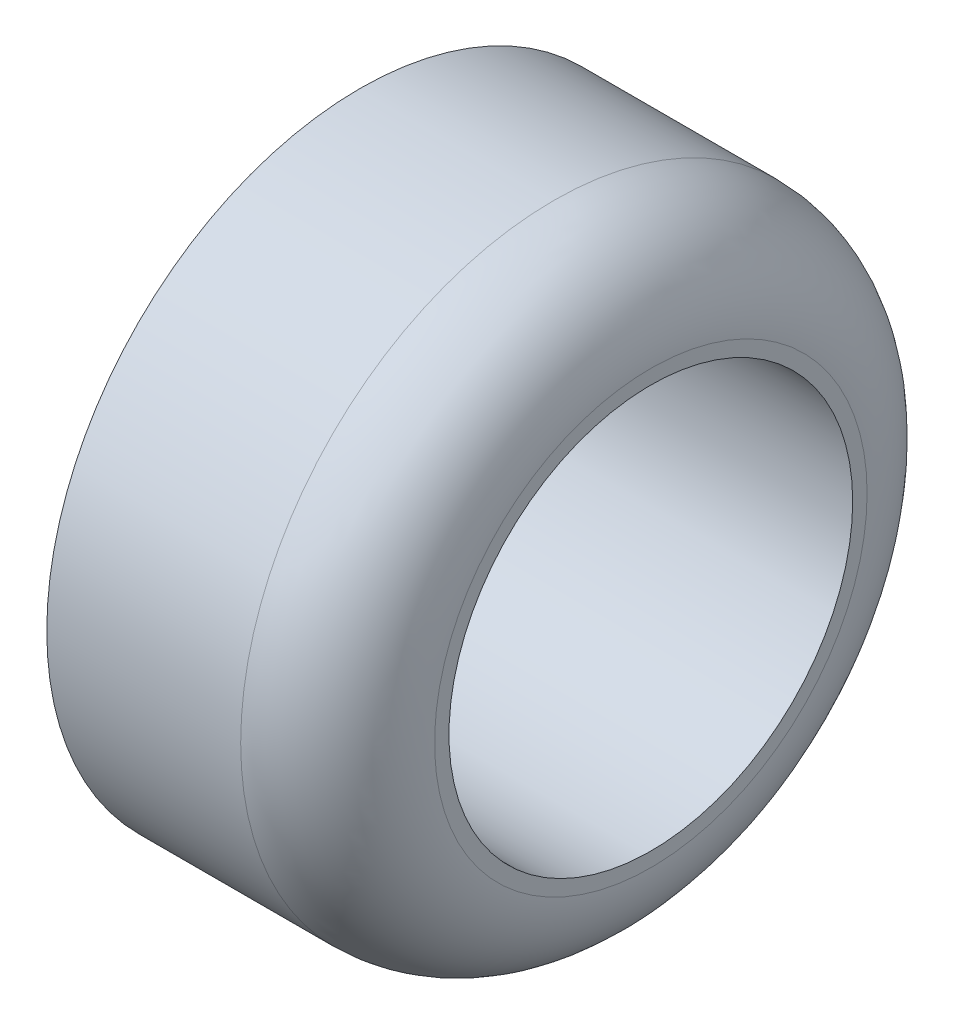
ISO-10303-21;
HEADER;
FILE_DESCRIPTION(('STEP AP214'),'2;1');
FILE_NAME('part.step','',(''),(''),'','','');
FILE_SCHEMA(('AUTOMOTIVE_DESIGN { 1 0 10303 214 1 1 1 1 }'));
ENDSEC;
DATA;
#1=APPLICATION_CONTEXT('core data for automotive mechanical design processes');
#2=APPLICATION_PROTOCOL_DEFINITION('international standard','automotive_design',2000,#1);
#3=PRODUCT_CONTEXT('',#1,'mechanical');
#4=PRODUCT('Part','Part','',(#3));
#5=PRODUCT_RELATED_PRODUCT_CATEGORY('part','',(#4));
#6=PRODUCT_DEFINITION_FORMATION('','',#4);
#7=PRODUCT_DEFINITION_CONTEXT('part definition',#1,'design');
#8=PRODUCT_DEFINITION('design','',#6,#7);
#9=PRODUCT_DEFINITION_SHAPE('','',#8);
#10=(LENGTH_UNIT() NAMED_UNIT(*) SI_UNIT(.MILLI.,.METRE.));
#11=(NAMED_UNIT(*) PLANE_ANGLE_UNIT() SI_UNIT($,.RADIAN.));
#12=(NAMED_UNIT(*) SI_UNIT($,.STERADIAN.) SOLID_ANGLE_UNIT());
#13=UNCERTAINTY_MEASURE_WITH_UNIT(LENGTH_MEASURE(1.E-05),#10,'distance_accuracy_value','');
#14=(GEOMETRIC_REPRESENTATION_CONTEXT(3) GLOBAL_UNCERTAINTY_ASSIGNED_CONTEXT((#13)) GLOBAL_UNIT_ASSIGNED_CONTEXT((#10,
#11,#12)) REPRESENTATION_CONTEXT('',''));
#15=CARTESIAN_POINT('',(0.,0.,0.));
#16=DIRECTION('',(0.,0.,1.));
#17=DIRECTION('',(1.,0.,0.));
#18=AXIS2_PLACEMENT_3D('',#15,#16,#17);
#19=CARTESIAN_POINT('',(-3.9624,0.,0.));
#20=DIRECTION('',(1.,0.,0.));
#21=DIRECTION('',(0.,0.,-1.));
#22=AXIS2_PLACEMENT_3D('',#19,#20,#21);
#23=CYLINDRICAL_SURFACE('',#22,4.2672);
#24=CARTESIAN_POINT('',(-1.320798984,0.,0.));
#25=DIRECTION('',(1.,0.,0.));
#26=DIRECTION('',(0.,0.,-1.));
#27=AXIS2_PLACEMENT_3D('',#24,#25,#26);
#28=CIRCLE('',#27,4.2672);
#29=CARTESIAN_POINT('',(-1.320798984,0.,-4.2672));
#30=VERTEX_POINT('',#29);
#31=EDGE_CURVE('E10',#30,#30,#28,.F.);
#32=ORIENTED_EDGE('',*,*,#31,.T.);
#33=EDGE_LOOP('',(#32));
#34=FACE_BOUND('',#33,.T.);
#35=CARTESIAN_POINT('',(-3.9624,0.,0.));
#36=DIRECTION('',(1.,0.,0.));
#37=DIRECTION('',(0.,0.,-1.));
#38=AXIS2_PLACEMENT_3D('',#35,#36,#37);
#39=CIRCLE('',#38,4.2672);
#40=CARTESIAN_POINT('',(-3.9624,0.,-4.2672));
#41=VERTEX_POINT('',#40);
#42=EDGE_CURVE('E46',#41,#41,#39,.T.);
#43=ORIENTED_EDGE('',*,*,#42,.T.);
#44=EDGE_LOOP('',(#43));
#45=FACE_BOUND('',#44,.T.);
#46=ADVANCED_FACE('F35',(#34,#45),#23,.T.);
#47=CARTESIAN_POINT('',(-3.9624,0.,0.));
#48=DIRECTION('',(1.,0.,0.));
#49=DIRECTION('',(0.,0.,-1.));
#50=AXIS2_PLACEMENT_3D('',#47,#48,#49);
#51=PLANE('',#50);
#52=CARTESIAN_POINT('',(-3.9624,0.,0.));
#53=DIRECTION('',(1.,0.,0.));
#54=DIRECTION('',(0.,0.,-1.));
#55=AXIS2_PLACEMENT_3D('',#52,#53,#54);
#56=CIRCLE('',#55,2.750058);
#57=CARTESIAN_POINT('',(-3.9624,0.,-2.750058));
#58=VERTEX_POINT('',#57);
#59=EDGE_CURVE('E50',#58,#58,#56,.T.);
#60=ORIENTED_EDGE('',*,*,#59,.T.);
#61=EDGE_LOOP('',(#60));
#62=FACE_BOUND('',#61,.T.);
#63=ORIENTED_EDGE('',*,*,#42,.F.);
#64=EDGE_LOOP('',(#63));
#65=FACE_BOUND('',#64,.T.);
#66=ADVANCED_FACE('F59',(#62,#65),#51,.F.);
#67=CARTESIAN_POINT('',(0.,0.,0.));
#68=DIRECTION('',(1.,0.,0.));
#69=DIRECTION('',(0.,0.,-1.));
#70=AXIS2_PLACEMENT_3D('',#67,#68,#69);
#71=PLANE('',#70);
#72=CARTESIAN_POINT('',(0.,0.,0.));
#73=DIRECTION('',(1.,0.,0.));
#74=DIRECTION('',(0.,0.,-1.));
#75=AXIS2_PLACEMENT_3D('',#72,#73,#74);
#76=CIRCLE('',#75,2.946401016);
#77=CARTESIAN_POINT('',(0.,0.,-2.946401016));
#78=VERTEX_POINT('',#77);
#79=EDGE_CURVE('E42',#78,#78,#76,.T.);
#80=ORIENTED_EDGE('',*,*,#79,.T.);
#81=EDGE_LOOP('',(#80));
#82=FACE_BOUND('',#81,.T.);
#83=CARTESIAN_POINT('',(0.,0.,0.));
#84=DIRECTION('',(1.,0.,0.));
#85=DIRECTION('',(0.,0.,-1.));
#86=AXIS2_PLACEMENT_3D('',#83,#84,#85);
#87=CIRCLE('',#86,2.750058);
#88=CARTESIAN_POINT('',(0.,0.,-2.750058));
#89=VERTEX_POINT('',#88);
#90=EDGE_CURVE('E53',#89,#89,#87,.T.);
#91=ORIENTED_EDGE('',*,*,#90,.F.);
#92=EDGE_LOOP('',(#91));
#93=FACE_BOUND('',#92,.T.);
#94=ADVANCED_FACE('F65',(#82,#93),#71,.T.);
#95=CARTESIAN_POINT('',(-3.9624,0.,0.));
#96=DIRECTION('',(1.,0.,0.));
#97=DIRECTION('',(0.,0.,-1.));
#98=AXIS2_PLACEMENT_3D('',#95,#96,#97);
#99=CYLINDRICAL_SURFACE('',#98,2.750058);
#100=ORIENTED_EDGE('',*,*,#59,.F.);
#101=EDGE_LOOP('',(#100));
#102=FACE_BOUND('',#101,.T.);
#103=ORIENTED_EDGE('',*,*,#90,.T.);
#104=EDGE_LOOP('',(#103));
#105=FACE_BOUND('',#104,.T.);
#106=ADVANCED_FACE('F62',(#102,#105),#99,.F.);
#107=CARTESIAN_POINT('',(-1.320798984,0.,0.));
#108=DIRECTION('',(1.,0.,0.));
#109=DIRECTION('',(0.,0.,-1.));
#110=AXIS2_PLACEMENT_3D('',#107,#108,#109);
#111=TOROIDAL_SURFACE('',#110,2.946401016,1.320798984);
#112=ORIENTED_EDGE('',*,*,#31,.F.);
#113=EDGE_LOOP('',(#112));
#114=FACE_BOUND('',#113,.T.);
#115=ORIENTED_EDGE('',*,*,#79,.F.);
#116=EDGE_LOOP('',(#115));
#117=FACE_BOUND('',#116,.T.);
#118=ADVANCED_FACE('F37',(#114,#117),#111,.T.);
#119=CLOSED_SHELL('',(#46,#66,#94,#106,#118));
#120=MANIFOLD_SOLID_BREP('B2',#119);
#121=ADVANCED_BREP_SHAPE_REPRESENTATION('',(#18,#120),#14);
#122=SHAPE_DEFINITION_REPRESENTATION(#9,#121);
ENDSEC;
END-ISO-10303-21;
